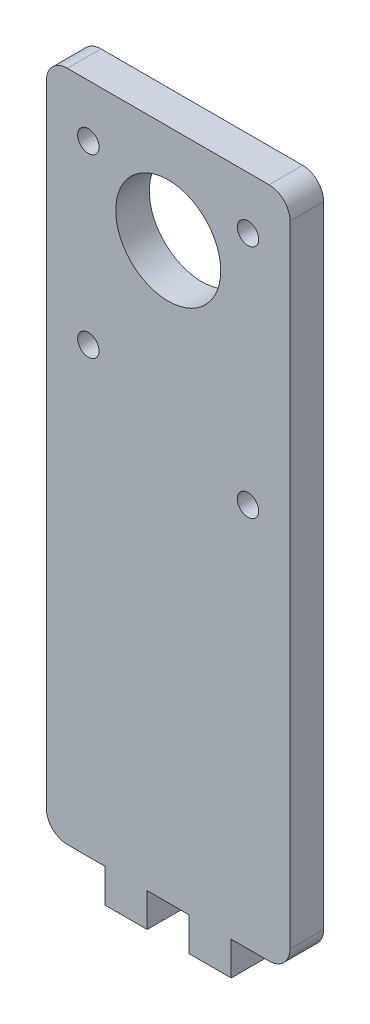
ISO-10303-21;
HEADER;
FILE_DESCRIPTION(('STEP AP214'),'2;1');
FILE_NAME('part.step','',(''),(''),'','','');
FILE_SCHEMA(('AUTOMOTIVE_DESIGN { 1 0 10303 214 1 1 1 1 }'));
ENDSEC;
DATA;
#1=APPLICATION_CONTEXT('core data for automotive mechanical design processes');
#2=APPLICATION_PROTOCOL_DEFINITION('international standard','automotive_design',2000,#1);
#3=PRODUCT_CONTEXT('',#1,'mechanical');
#4=PRODUCT('Part','Part','',(#3));
#5=PRODUCT_RELATED_PRODUCT_CATEGORY('part','',(#4));
#6=PRODUCT_DEFINITION_FORMATION('','',#4);
#7=PRODUCT_DEFINITION_CONTEXT('part definition',#1,'design');
#8=PRODUCT_DEFINITION('design','',#6,#7);
#9=PRODUCT_DEFINITION_SHAPE('','',#8);
#10=(LENGTH_UNIT() NAMED_UNIT(*) SI_UNIT(.MILLI.,.METRE.));
#11=(NAMED_UNIT(*) PLANE_ANGLE_UNIT() SI_UNIT($,.RADIAN.));
#12=(NAMED_UNIT(*) SI_UNIT($,.STERADIAN.) SOLID_ANGLE_UNIT());
#13=UNCERTAINTY_MEASURE_WITH_UNIT(LENGTH_MEASURE(1.E-05),#10,'distance_accuracy_value','');
#14=(GEOMETRIC_REPRESENTATION_CONTEXT(3) GLOBAL_UNCERTAINTY_ASSIGNED_CONTEXT((#13)) GLOBAL_UNIT_ASSIGNED_CONTEXT((#10,
#11,#12)) REPRESENTATION_CONTEXT('',''));
#15=CARTESIAN_POINT('',(0.,0.,0.));
#16=DIRECTION('',(0.,0.,1.));
#17=DIRECTION('',(1.,0.,0.));
#18=AXIS2_PLACEMENT_3D('',#15,#16,#17);
#19=CARTESIAN_POINT('',(-29.,-80.,8.));
#20=DIRECTION('',(0.,1.,0.));
#21=DIRECTION('',(0.,0.,1.));
#22=AXIS2_PLACEMENT_3D('',#19,#20,#21);
#23=PLANE('',#22);
#24=DIRECTION('',(0.,0.,-1.));
#25=VECTOR('',#24,1.);
#26=CARTESIAN_POINT('',(5.,-80.,0.));
#27=LINE('',#26,#25);
#28=CARTESIAN_POINT('',(4.99999999999998,-80.,8.));
#29=VERTEX_POINT('',#28);
#30=CARTESIAN_POINT('',(4.99999999999998,-80.,0.));
#31=VERTEX_POINT('',#30);
#32=EDGE_CURVE('E175',#29,#31,#27,.T.);
#33=ORIENTED_EDGE('',*,*,#32,.F.);
#34=DIRECTION('',(1.,0.,0.));
#35=VECTOR('',#34,1.);
#36=CARTESIAN_POINT('',(-29.,-80.,8.));
#37=LINE('',#36,#35);
#38=CARTESIAN_POINT('',(-5.00000000000002,-80.,8.));
#39=VERTEX_POINT('',#38);
#40=EDGE_CURVE('E244',#39,#29,#37,.T.);
#41=ORIENTED_EDGE('',*,*,#40,.F.);
#42=DIRECTION('',(0.,0.,1.));
#43=VECTOR('',#42,1.);
#44=CARTESIAN_POINT('',(-5.,-80.,0.));
#45=LINE('',#44,#43);
#46=CARTESIAN_POINT('',(-5.00000000000002,-80.,0.));
#47=VERTEX_POINT('',#46);
#48=EDGE_CURVE('E176',#47,#39,#45,.T.);
#49=ORIENTED_EDGE('',*,*,#48,.F.);
#50=DIRECTION('',(1.,0.,0.));
#51=VECTOR('',#50,1.);
#52=CARTESIAN_POINT('',(-29.,-80.,0.));
#53=LINE('',#52,#51);
#54=EDGE_CURVE('E212',#47,#31,#53,.T.);
#55=ORIENTED_EDGE('',*,*,#54,.T.);
#56=EDGE_LOOP('',(#33,#41,#49,#55));
#57=FACE_BOUND('',#56,.T.);
#58=ADVANCED_FACE('F35',(#57),#23,.F.);
#59=CARTESIAN_POINT('',(15.,-80.,0.));
#60=VERTEX_POINT('',#59);
#61=CARTESIAN_POINT('',(24.,-80.,0.));
#62=VERTEX_POINT('',#61);
#63=EDGE_CURVE('E208',#60,#62,#53,.T.);
#64=ORIENTED_EDGE('',*,*,#63,.T.);
#65=DIRECTION('',(0.,0.,-1.));
#66=VECTOR('',#65,1.);
#67=CARTESIAN_POINT('',(24.,-80.,8.));
#68=LINE('',#67,#66);
#69=CARTESIAN_POINT('',(24.,-80.,8.));
#70=VERTEX_POINT('',#69);
#71=EDGE_CURVE('E238',#62,#70,#68,.F.);
#72=ORIENTED_EDGE('',*,*,#71,.T.);
#73=CARTESIAN_POINT('',(15.,-80.,8.));
#74=VERTEX_POINT('',#73);
#75=EDGE_CURVE('E214',#74,#70,#37,.T.);
#76=ORIENTED_EDGE('',*,*,#75,.F.);
#77=DIRECTION('',(0.,0.,1.));
#78=VECTOR('',#77,1.);
#79=CARTESIAN_POINT('',(15.,-80.,0.));
#80=LINE('',#79,#78);
#81=EDGE_CURVE('E172',#60,#74,#80,.T.);
#82=ORIENTED_EDGE('',*,*,#81,.F.);
#83=EDGE_LOOP('',(#64,#72,#76,#82));
#84=FACE_BOUND('',#83,.T.);
#85=ADVANCED_FACE('F348',(#84),#23,.F.);
#86=CARTESIAN_POINT('',(-24.,-80.,8.));
#87=VERTEX_POINT('',#86);
#88=CARTESIAN_POINT('',(-15.,-80.,8.));
#89=VERTEX_POINT('',#88);
#90=EDGE_CURVE('E241',#87,#89,#37,.T.);
#91=ORIENTED_EDGE('',*,*,#90,.F.);
#92=DIRECTION('',(0.,0.,-1.));
#93=VECTOR('',#92,1.);
#94=CARTESIAN_POINT('',(-24.,-80.,8.));
#95=LINE('',#94,#93);
#96=CARTESIAN_POINT('',(-24.,-80.,0.));
#97=VERTEX_POINT('',#96);
#98=EDGE_CURVE('E321',#87,#97,#95,.T.);
#99=ORIENTED_EDGE('',*,*,#98,.T.);
#100=CARTESIAN_POINT('',(-15.,-80.,0.));
#101=VERTEX_POINT('',#100);
#102=EDGE_CURVE('E225',#97,#101,#53,.T.);
#103=ORIENTED_EDGE('',*,*,#102,.T.);
#104=DIRECTION('',(0.,0.,-1.));
#105=VECTOR('',#104,1.);
#106=CARTESIAN_POINT('',(-15.,-80.,0.));
#107=LINE('',#106,#105);
#108=EDGE_CURVE('E179',#89,#101,#107,.T.);
#109=ORIENTED_EDGE('',*,*,#108,.F.);
#110=EDGE_LOOP('',(#91,#99,#103,#109));
#111=FACE_BOUND('',#110,.T.);
#112=ADVANCED_FACE('F373',(#111),#23,.F.);
#113=CARTESIAN_POINT('',(29.,-80.,8.));
#114=DIRECTION('',(-1.,0.,0.));
#115=DIRECTION('',(0.,0.,1.));
#116=AXIS2_PLACEMENT_3D('',#113,#114,#115);
#117=PLANE('',#116);
#118=DIRECTION('',(0.,1.,0.));
#119=VECTOR('',#118,1.);
#120=CARTESIAN_POINT('',(29.,-80.,8.));
#121=LINE('',#120,#119);
#122=CARTESIAN_POINT('',(29.,-75.,8.));
#123=VERTEX_POINT('',#122);
#124=CARTESIAN_POINT('',(29.,75.,8.));
#125=VERTEX_POINT('',#124);
#126=EDGE_CURVE('E228',#123,#125,#121,.T.);
#127=ORIENTED_EDGE('',*,*,#126,.F.);
#128=DIRECTION('',(0.,0.,-1.));
#129=VECTOR('',#128,1.);
#130=CARTESIAN_POINT('',(29.,-75.,8.));
#131=LINE('',#130,#129);
#132=CARTESIAN_POINT('',(29.,-75.,0.));
#133=VERTEX_POINT('',#132);
#134=EDGE_CURVE('E229',#123,#133,#131,.T.);
#135=ORIENTED_EDGE('',*,*,#134,.T.);
#136=DIRECTION('',(0.,1.,0.));
#137=VECTOR('',#136,1.);
#138=CARTESIAN_POINT('',(29.,-80.,0.));
#139=LINE('',#138,#137);
#140=CARTESIAN_POINT('',(29.,75.,0.));
#141=VERTEX_POINT('',#140);
#142=EDGE_CURVE('E251',#133,#141,#139,.T.);
#143=ORIENTED_EDGE('',*,*,#142,.T.);
#144=DIRECTION('',(0.,0.,-1.));
#145=VECTOR('',#144,1.);
#146=CARTESIAN_POINT('',(29.,75.,8.));
#147=LINE('',#146,#145);
#148=EDGE_CURVE('E243',#141,#125,#147,.F.);
#149=ORIENTED_EDGE('',*,*,#148,.T.);
#150=EDGE_LOOP('',(#127,#135,#143,#149));
#151=FACE_BOUND('',#150,.T.);
#152=ADVANCED_FACE('F347',(#151),#117,.F.);
#153=CARTESIAN_POINT('',(-29.,80.,8.));
#154=DIRECTION('',(0.,-1.,0.));
#155=DIRECTION('',(0.,0.,-1.));
#156=AXIS2_PLACEMENT_3D('',#153,#154,#155);
#157=PLANE('',#156);
#158=DIRECTION('',(-1.,0.,0.));
#159=VECTOR('',#158,1.);
#160=CARTESIAN_POINT('',(-29.,80.,8.));
#161=LINE('',#160,#159);
#162=CARTESIAN_POINT('',(24.,80.,8.));
#163=VERTEX_POINT('',#162);
#164=CARTESIAN_POINT('',(-24.,80.,8.));
#165=VERTEX_POINT('',#164);
#166=EDGE_CURVE('E302',#163,#165,#161,.T.);
#167=ORIENTED_EDGE('',*,*,#166,.F.);
#168=DIRECTION('',(0.,0.,-1.));
#169=VECTOR('',#168,1.);
#170=CARTESIAN_POINT('',(24.,80.,8.));
#171=LINE('',#170,#169);
#172=CARTESIAN_POINT('',(24.,80.,0.));
#173=VERTEX_POINT('',#172);
#174=EDGE_CURVE('E11',#163,#173,#171,.T.);
#175=ORIENTED_EDGE('',*,*,#174,.T.);
#176=DIRECTION('',(-1.,0.,0.));
#177=VECTOR('',#176,1.);
#178=CARTESIAN_POINT('',(-29.,80.,0.));
#179=LINE('',#178,#177);
#180=CARTESIAN_POINT('',(-24.,80.,0.));
#181=VERTEX_POINT('',#180);
#182=EDGE_CURVE('E337',#173,#181,#179,.T.);
#183=ORIENTED_EDGE('',*,*,#182,.T.);
#184=DIRECTION('',(0.,0.,-1.));
#185=VECTOR('',#184,1.);
#186=CARTESIAN_POINT('',(-24.,80.,8.));
#187=LINE('',#186,#185);
#188=EDGE_CURVE('E43',#181,#165,#187,.F.);
#189=ORIENTED_EDGE('',*,*,#188,.T.);
#190=EDGE_LOOP('',(#167,#175,#183,#189));
#191=FACE_BOUND('',#190,.T.);
#192=ADVANCED_FACE('F334',(#191),#157,.F.);
#193=CARTESIAN_POINT('',(-29.,-80.,8.));
#194=DIRECTION('',(1.,0.,0.));
#195=DIRECTION('',(0.,0.,-1.));
#196=AXIS2_PLACEMENT_3D('',#193,#194,#195);
#197=PLANE('',#196);
#198=DIRECTION('',(0.,-1.,0.));
#199=VECTOR('',#198,1.);
#200=CARTESIAN_POINT('',(-29.,-80.,0.));
#201=LINE('',#200,#199);
#202=CARTESIAN_POINT('',(-29.,75.,0.));
#203=VERTEX_POINT('',#202);
#204=CARTESIAN_POINT('',(-29.,-75.,0.));
#205=VERTEX_POINT('',#204);
#206=EDGE_CURVE('E213',#203,#205,#201,.T.);
#207=ORIENTED_EDGE('',*,*,#206,.T.);
#208=DIRECTION('',(0.,0.,-1.));
#209=VECTOR('',#208,1.);
#210=CARTESIAN_POINT('',(-29.,-75.,8.));
#211=LINE('',#210,#209);
#212=CARTESIAN_POINT('',(-29.,-75.,8.));
#213=VERTEX_POINT('',#212);
#214=EDGE_CURVE('E58',#205,#213,#211,.F.);
#215=ORIENTED_EDGE('',*,*,#214,.T.);
#216=DIRECTION('',(0.,-1.,0.));
#217=VECTOR('',#216,1.);
#218=CARTESIAN_POINT('',(-29.,-80.,8.));
#219=LINE('',#218,#217);
#220=CARTESIAN_POINT('',(-29.,75.,8.));
#221=VERTEX_POINT('',#220);
#222=EDGE_CURVE('E249',#221,#213,#219,.T.);
#223=ORIENTED_EDGE('',*,*,#222,.F.);
#224=DIRECTION('',(0.,0.,-1.));
#225=VECTOR('',#224,1.);
#226=CARTESIAN_POINT('',(-29.,75.,8.));
#227=LINE('',#226,#225);
#228=EDGE_CURVE('E324',#221,#203,#227,.T.);
#229=ORIENTED_EDGE('',*,*,#228,.T.);
#230=EDGE_LOOP('',(#207,#215,#223,#229));
#231=FACE_BOUND('',#230,.T.);
#232=ADVANCED_FACE('F377',(#231),#197,.F.);
#233=CARTESIAN_POINT('',(0.,0.,8.));
#234=DIRECTION('',(0.,0.,-1.));
#235=DIRECTION('',(-1.,0.,0.));
#236=AXIS2_PLACEMENT_3D('',#233,#234,#235);
#237=PLANE('',#236);
#238=CARTESIAN_POINT('',(0.,56.5,8.));
#239=DIRECTION('',(0.,0.,1.));
#240=DIRECTION('',(1.,0.,0.));
#241=AXIS2_PLACEMENT_3D('',#238,#239,#240);
#242=CIRCLE('',#241,12.5);
#243=CARTESIAN_POINT('',(12.5,56.5,8.));
#244=VERTEX_POINT('',#243);
#245=EDGE_CURVE('E268',#244,#244,#242,.T.);
#246=ORIENTED_EDGE('',*,*,#245,.F.);
#247=EDGE_LOOP('',(#246));
#248=FACE_BOUND('',#247,.T.);
#249=CARTESIAN_POINT('',(19.0000000000027,11.5000000000061,8.));
#250=DIRECTION('',(0.,0.,1.));
#251=DIRECTION('',(1.,0.,0.));
#252=AXIS2_PLACEMENT_3D('',#249,#250,#251);
#253=CIRCLE('',#252,2.55);
#254=CARTESIAN_POINT('',(21.5500000000027,11.5000000000061,8.));
#255=VERTEX_POINT('',#254);
#256=EDGE_CURVE('E276',#255,#255,#253,.T.);
#257=ORIENTED_EDGE('',*,*,#256,.F.);
#258=EDGE_LOOP('',(#257));
#259=FACE_BOUND('',#258,.T.);
#260=CARTESIAN_POINT('',(-19.0000000000027,25.4999999999969,8.));
#261=DIRECTION('',(0.,0.,1.));
#262=DIRECTION('',(1.,0.,0.));
#263=AXIS2_PLACEMENT_3D('',#260,#261,#262);
#264=CIRCLE('',#263,2.55);
#265=CARTESIAN_POINT('',(-16.4500000000027,25.4999999999969,8.));
#266=VERTEX_POINT('',#265);
#267=EDGE_CURVE('E281',#266,#266,#264,.T.);
#268=ORIENTED_EDGE('',*,*,#267,.F.);
#269=EDGE_LOOP('',(#268));
#270=FACE_BOUND('',#269,.T.);
#271=CARTESIAN_POINT('',(19.0000000000027,67.4999999999977,8.));
#272=DIRECTION('',(0.,0.,1.));
#273=DIRECTION('',(1.,0.,0.));
#274=AXIS2_PLACEMENT_3D('',#271,#272,#273);
#275=CIRCLE('',#274,2.55);
#276=CARTESIAN_POINT('',(21.5500000000027,67.4999999999977,8.));
#277=VERTEX_POINT('',#276);
#278=EDGE_CURVE('E287',#277,#277,#275,.T.);
#279=ORIENTED_EDGE('',*,*,#278,.F.);
#280=EDGE_LOOP('',(#279));
#281=FACE_BOUND('',#280,.T.);
#282=CARTESIAN_POINT('',(-19.,67.5,8.));
#283=DIRECTION('',(0.,0.,1.));
#284=DIRECTION('',(1.,0.,0.));
#285=AXIS2_PLACEMENT_3D('',#282,#283,#284);
#286=CIRCLE('',#285,2.55);
#287=CARTESIAN_POINT('',(-16.45,67.5,8.));
#288=VERTEX_POINT('',#287);
#289=EDGE_CURVE('E293',#288,#288,#286,.T.);
#290=ORIENTED_EDGE('',*,*,#289,.F.);
#291=EDGE_LOOP('',(#290));
#292=FACE_BOUND('',#291,.T.);
#293=ORIENTED_EDGE('',*,*,#75,.T.);
#294=CARTESIAN_POINT('',(24.,-75.,8.));
#295=DIRECTION('',(0.,0.,-1.));
#296=DIRECTION('',(-1.,0.,0.));
#297=AXIS2_PLACEMENT_3D('',#294,#295,#296);
#298=CIRCLE('',#297,5.);
#299=EDGE_CURVE('E310',#70,#123,#298,.F.);
#300=ORIENTED_EDGE('',*,*,#299,.T.);
#301=ORIENTED_EDGE('',*,*,#126,.T.);
#302=CARTESIAN_POINT('',(24.,75.,8.));
#303=DIRECTION('',(0.,0.,-1.));
#304=DIRECTION('',(-1.,0.,0.));
#305=AXIS2_PLACEMENT_3D('',#302,#303,#304);
#306=CIRCLE('',#305,5.);
#307=EDGE_CURVE('E326',#125,#163,#306,.F.);
#308=ORIENTED_EDGE('',*,*,#307,.T.);
#309=ORIENTED_EDGE('',*,*,#166,.T.);
#310=CARTESIAN_POINT('',(-24.,75.,8.));
#311=DIRECTION('',(0.,0.,-1.));
#312=DIRECTION('',(-1.,0.,0.));
#313=AXIS2_PLACEMENT_3D('',#310,#311,#312);
#314=CIRCLE('',#313,5.);
#315=EDGE_CURVE('E240',#165,#221,#314,.F.);
#316=ORIENTED_EDGE('',*,*,#315,.T.);
#317=ORIENTED_EDGE('',*,*,#222,.T.);
#318=CARTESIAN_POINT('',(-24.,-75.,8.));
#319=DIRECTION('',(0.,0.,-1.));
#320=DIRECTION('',(-1.,0.,0.));
#321=AXIS2_PLACEMENT_3D('',#318,#319,#320);
#322=CIRCLE('',#321,5.);
#323=EDGE_CURVE('E50',#213,#87,#322,.F.);
#324=ORIENTED_EDGE('',*,*,#323,.T.);
#325=ORIENTED_EDGE('',*,*,#90,.T.);
#326=DIRECTION('',(0.,1.,0.));
#327=VECTOR('',#326,1.);
#328=CARTESIAN_POINT('',(-15.,-88.,8.));
#329=LINE('',#328,#327);
#330=CARTESIAN_POINT('',(-15.,-88.,8.));
#331=VERTEX_POINT('',#330);
#332=EDGE_CURVE('E260',#331,#89,#329,.T.);
#333=ORIENTED_EDGE('',*,*,#332,.F.);
#334=DIRECTION('',(-1.,0.,0.));
#335=VECTOR('',#334,1.);
#336=CARTESIAN_POINT('',(-5.,-88.,8.));
#337=LINE('',#336,#335);
#338=CARTESIAN_POINT('',(-5.,-88.,8.));
#339=VERTEX_POINT('',#338);
#340=EDGE_CURVE('E188',#339,#331,#337,.T.);
#341=ORIENTED_EDGE('',*,*,#340,.F.);
#342=DIRECTION('',(0.,1.,0.));
#343=VECTOR('',#342,1.);
#344=CARTESIAN_POINT('',(-5.,-88.,8.));
#345=LINE('',#344,#343);
#346=EDGE_CURVE('E265',#339,#39,#345,.T.);
#347=ORIENTED_EDGE('',*,*,#346,.T.);
#348=ORIENTED_EDGE('',*,*,#40,.T.);
#349=DIRECTION('',(0.,1.,0.));
#350=VECTOR('',#349,1.);
#351=CARTESIAN_POINT('',(5.,-88.,8.));
#352=LINE('',#351,#350);
#353=CARTESIAN_POINT('',(5.,-88.,8.));
#354=VERTEX_POINT('',#353);
#355=EDGE_CURVE('E353',#354,#29,#352,.T.);
#356=ORIENTED_EDGE('',*,*,#355,.F.);
#357=DIRECTION('',(-1.,0.,0.));
#358=VECTOR('',#357,1.);
#359=CARTESIAN_POINT('',(5.,-88.,8.));
#360=LINE('',#359,#358);
#361=CARTESIAN_POINT('',(15.,-88.,8.));
#362=VERTEX_POINT('',#361);
#363=EDGE_CURVE('E168',#362,#354,#360,.T.);
#364=ORIENTED_EDGE('',*,*,#363,.F.);
#365=DIRECTION('',(0.,1.,0.));
#366=VECTOR('',#365,1.);
#367=CARTESIAN_POINT('',(15.,-88.,8.));
#368=LINE('',#367,#366);
#369=EDGE_CURVE('E181',#362,#74,#368,.T.);
#370=ORIENTED_EDGE('',*,*,#369,.T.);
#371=EDGE_LOOP('',(#293,#300,#301,#308,#309,#316,#317,#324,#325,#333,#341,#347,#348,#356,#364,#370));
#372=FACE_BOUND('',#371,.T.);
#373=ADVANCED_FACE('F309',(#248,#259,#270,#281,#292,#372),#237,.F.);
#374=CARTESIAN_POINT('',(0.,0.,0.));
#375=DIRECTION('',(0.,0.,-1.));
#376=DIRECTION('',(-1.,0.,0.));
#377=AXIS2_PLACEMENT_3D('',#374,#375,#376);
#378=PLANE('',#377);
#379=CARTESIAN_POINT('',(0.,56.5,0.));
#380=DIRECTION('',(0.,0.,1.));
#381=DIRECTION('',(1.,0.,0.));
#382=AXIS2_PLACEMENT_3D('',#379,#380,#381);
#383=CIRCLE('',#382,12.5);
#384=CARTESIAN_POINT('',(12.5,56.5,0.));
#385=VERTEX_POINT('',#384);
#386=EDGE_CURVE('E271',#385,#385,#383,.T.);
#387=ORIENTED_EDGE('',*,*,#386,.T.);
#388=EDGE_LOOP('',(#387));
#389=FACE_BOUND('',#388,.T.);
#390=CARTESIAN_POINT('',(19.0000000000027,11.5000000000061,0.));
#391=DIRECTION('',(0.,0.,1.));
#392=DIRECTION('',(1.,0.,0.));
#393=AXIS2_PLACEMENT_3D('',#390,#391,#392);
#394=CIRCLE('',#393,2.55);
#395=CARTESIAN_POINT('',(21.5500000000027,11.5000000000061,0.));
#396=VERTEX_POINT('',#395);
#397=EDGE_CURVE('E278',#396,#396,#394,.T.);
#398=ORIENTED_EDGE('',*,*,#397,.T.);
#399=EDGE_LOOP('',(#398));
#400=FACE_BOUND('',#399,.T.);
#401=CARTESIAN_POINT('',(-19.0000000000027,25.4999999999969,0.));
#402=DIRECTION('',(0.,0.,1.));
#403=DIRECTION('',(1.,0.,0.));
#404=AXIS2_PLACEMENT_3D('',#401,#402,#403);
#405=CIRCLE('',#404,2.55);
#406=CARTESIAN_POINT('',(-16.4500000000027,25.4999999999969,0.));
#407=VERTEX_POINT('',#406);
#408=EDGE_CURVE('E284',#407,#407,#405,.T.);
#409=ORIENTED_EDGE('',*,*,#408,.T.);
#410=EDGE_LOOP('',(#409));
#411=FACE_BOUND('',#410,.T.);
#412=CARTESIAN_POINT('',(19.0000000000027,67.4999999999977,0.));
#413=DIRECTION('',(0.,0.,1.));
#414=DIRECTION('',(1.,0.,0.));
#415=AXIS2_PLACEMENT_3D('',#412,#413,#414);
#416=CIRCLE('',#415,2.55);
#417=CARTESIAN_POINT('',(21.5500000000027,67.4999999999977,0.));
#418=VERTEX_POINT('',#417);
#419=EDGE_CURVE('E290',#418,#418,#416,.T.);
#420=ORIENTED_EDGE('',*,*,#419,.T.);
#421=EDGE_LOOP('',(#420));
#422=FACE_BOUND('',#421,.T.);
#423=CARTESIAN_POINT('',(-19.,67.5,0.));
#424=DIRECTION('',(0.,0.,1.));
#425=DIRECTION('',(1.,0.,0.));
#426=AXIS2_PLACEMENT_3D('',#423,#424,#425);
#427=CIRCLE('',#426,2.55);
#428=CARTESIAN_POINT('',(-16.45,67.5,0.));
#429=VERTEX_POINT('',#428);
#430=EDGE_CURVE('E296',#429,#429,#427,.T.);
#431=ORIENTED_EDGE('',*,*,#430,.T.);
#432=EDGE_LOOP('',(#431));
#433=FACE_BOUND('',#432,.T.);
#434=ORIENTED_EDGE('',*,*,#142,.F.);
#435=CARTESIAN_POINT('',(24.,-75.,0.));
#436=DIRECTION('',(0.,0.,-1.));
#437=DIRECTION('',(-1.,0.,0.));
#438=AXIS2_PLACEMENT_3D('',#435,#436,#437);
#439=CIRCLE('',#438,5.);
#440=EDGE_CURVE('E236',#133,#62,#439,.T.);
#441=ORIENTED_EDGE('',*,*,#440,.T.);
#442=ORIENTED_EDGE('',*,*,#63,.F.);
#443=DIRECTION('',(0.,1.,0.));
#444=VECTOR('',#443,1.);
#445=CARTESIAN_POINT('',(15.,-88.,0.));
#446=LINE('',#445,#444);
#447=CARTESIAN_POINT('',(15.,-88.,0.));
#448=VERTEX_POINT('',#447);
#449=EDGE_CURVE('E159',#448,#60,#446,.T.);
#450=ORIENTED_EDGE('',*,*,#449,.F.);
#451=DIRECTION('',(1.,0.,0.));
#452=VECTOR('',#451,1.);
#453=CARTESIAN_POINT('',(5.,-88.,0.));
#454=LINE('',#453,#452);
#455=CARTESIAN_POINT('',(5.,-88.,0.));
#456=VERTEX_POINT('',#455);
#457=EDGE_CURVE('E150',#456,#448,#454,.T.);
#458=ORIENTED_EDGE('',*,*,#457,.F.);
#459=DIRECTION('',(0.,1.,0.));
#460=VECTOR('',#459,1.);
#461=CARTESIAN_POINT('',(5.,-88.,0.));
#462=LINE('',#461,#460);
#463=EDGE_CURVE('E156',#456,#31,#462,.T.);
#464=ORIENTED_EDGE('',*,*,#463,.T.);
#465=ORIENTED_EDGE('',*,*,#54,.F.);
#466=DIRECTION('',(0.,1.,0.));
#467=VECTOR('',#466,1.);
#468=CARTESIAN_POINT('',(-5.,-88.,0.));
#469=LINE('',#468,#467);
#470=CARTESIAN_POINT('',(-5.,-88.,0.));
#471=VERTEX_POINT('',#470);
#472=EDGE_CURVE('E194',#471,#47,#469,.T.);
#473=ORIENTED_EDGE('',*,*,#472,.F.);
#474=DIRECTION('',(1.,0.,0.));
#475=VECTOR('',#474,1.);
#476=CARTESIAN_POINT('',(-5.,-88.,0.));
#477=LINE('',#476,#475);
#478=CARTESIAN_POINT('',(-15.,-88.,0.));
#479=VERTEX_POINT('',#478);
#480=EDGE_CURVE('E192',#479,#471,#477,.T.);
#481=ORIENTED_EDGE('',*,*,#480,.F.);
#482=DIRECTION('',(0.,1.,0.));
#483=VECTOR('',#482,1.);
#484=CARTESIAN_POINT('',(-15.,-88.,0.));
#485=LINE('',#484,#483);
#486=EDGE_CURVE('E205',#479,#101,#485,.T.);
#487=ORIENTED_EDGE('',*,*,#486,.T.);
#488=ORIENTED_EDGE('',*,*,#102,.F.);
#489=CARTESIAN_POINT('',(-24.,-75.,0.));
#490=DIRECTION('',(0.,0.,-1.));
#491=DIRECTION('',(-1.,0.,0.));
#492=AXIS2_PLACEMENT_3D('',#489,#490,#491);
#493=CIRCLE('',#492,5.);
#494=EDGE_CURVE('E234',#97,#205,#493,.T.);
#495=ORIENTED_EDGE('',*,*,#494,.T.);
#496=ORIENTED_EDGE('',*,*,#206,.F.);
#497=CARTESIAN_POINT('',(-24.,75.,0.));
#498=DIRECTION('',(0.,0.,-1.));
#499=DIRECTION('',(-1.,0.,0.));
#500=AXIS2_PLACEMENT_3D('',#497,#498,#499);
#501=CIRCLE('',#500,5.);
#502=EDGE_CURVE('E230',#203,#181,#501,.T.);
#503=ORIENTED_EDGE('',*,*,#502,.T.);
#504=ORIENTED_EDGE('',*,*,#182,.F.);
#505=CARTESIAN_POINT('',(24.,75.,0.));
#506=DIRECTION('',(0.,0.,-1.));
#507=DIRECTION('',(-1.,0.,0.));
#508=AXIS2_PLACEMENT_3D('',#505,#506,#507);
#509=CIRCLE('',#508,5.);
#510=EDGE_CURVE('E232',#173,#141,#509,.T.);
#511=ORIENTED_EDGE('',*,*,#510,.T.);
#512=EDGE_LOOP('',(#434,#441,#442,#450,#458,#464,#465,#473,#481,#487,#488,#495,#496,#503,#504,#511));
#513=FACE_BOUND('',#512,.T.);
#514=ADVANCED_FACE('F153',(#389,#400,#411,#422,#433,#513),#378,.T.);
#515=CARTESIAN_POINT('',(-19.,67.5,0.));
#516=DIRECTION('',(0.,0.,1.));
#517=DIRECTION('',(1.,0.,0.));
#518=AXIS2_PLACEMENT_3D('',#515,#516,#517);
#519=CYLINDRICAL_SURFACE('',#518,2.55);
#520=ORIENTED_EDGE('',*,*,#430,.F.);
#521=EDGE_LOOP('',(#520));
#522=FACE_BOUND('',#521,.T.);
#523=ORIENTED_EDGE('',*,*,#289,.T.);
#524=EDGE_LOOP('',(#523));
#525=FACE_BOUND('',#524,.T.);
#526=ADVANCED_FACE('F437',(#522,#525),#519,.F.);
#527=CARTESIAN_POINT('',(19.0000000000027,67.4999999999977,0.));
#528=DIRECTION('',(0.,0.,1.));
#529=DIRECTION('',(1.,0.,0.));
#530=AXIS2_PLACEMENT_3D('',#527,#528,#529);
#531=CYLINDRICAL_SURFACE('',#530,2.55);
#532=ORIENTED_EDGE('',*,*,#419,.F.);
#533=EDGE_LOOP('',(#532));
#534=FACE_BOUND('',#533,.T.);
#535=ORIENTED_EDGE('',*,*,#278,.T.);
#536=EDGE_LOOP('',(#535));
#537=FACE_BOUND('',#536,.T.);
#538=ADVANCED_FACE('F551',(#534,#537),#531,.F.);
#539=CARTESIAN_POINT('',(-19.0000000000027,25.4999999999969,0.));
#540=DIRECTION('',(0.,0.,1.));
#541=DIRECTION('',(1.,0.,0.));
#542=AXIS2_PLACEMENT_3D('',#539,#540,#541);
#543=CYLINDRICAL_SURFACE('',#542,2.55);
#544=ORIENTED_EDGE('',*,*,#408,.F.);
#545=EDGE_LOOP('',(#544));
#546=FACE_BOUND('',#545,.T.);
#547=ORIENTED_EDGE('',*,*,#267,.T.);
#548=EDGE_LOOP('',(#547));
#549=FACE_BOUND('',#548,.T.);
#550=ADVANCED_FACE('F541',(#546,#549),#543,.F.);
#551=CARTESIAN_POINT('',(19.0000000000027,11.5000000000061,0.));
#552=DIRECTION('',(0.,0.,1.));
#553=DIRECTION('',(1.,0.,0.));
#554=AXIS2_PLACEMENT_3D('',#551,#552,#553);
#555=CYLINDRICAL_SURFACE('',#554,2.55);
#556=ORIENTED_EDGE('',*,*,#397,.F.);
#557=EDGE_LOOP('',(#556));
#558=FACE_BOUND('',#557,.T.);
#559=ORIENTED_EDGE('',*,*,#256,.T.);
#560=EDGE_LOOP('',(#559));
#561=FACE_BOUND('',#560,.T.);
#562=ADVANCED_FACE('F531',(#558,#561),#555,.F.);
#563=CARTESIAN_POINT('',(0.,56.5,0.));
#564=DIRECTION('',(0.,0.,1.));
#565=DIRECTION('',(1.,0.,0.));
#566=AXIS2_PLACEMENT_3D('',#563,#564,#565);
#567=CYLINDRICAL_SURFACE('',#566,12.5);
#568=ORIENTED_EDGE('',*,*,#386,.F.);
#569=EDGE_LOOP('',(#568));
#570=FACE_BOUND('',#569,.T.);
#571=ORIENTED_EDGE('',*,*,#245,.T.);
#572=EDGE_LOOP('',(#571));
#573=FACE_BOUND('',#572,.T.);
#574=ADVANCED_FACE('F519',(#570,#573),#567,.F.);
#575=CARTESIAN_POINT('',(-5.,-88.,0.));
#576=DIRECTION('',(-1.,0.,0.));
#577=DIRECTION('',(0.,0.,1.));
#578=AXIS2_PLACEMENT_3D('',#575,#576,#577);
#579=PLANE('',#578);
#580=ORIENTED_EDGE('',*,*,#48,.T.);
#581=ORIENTED_EDGE('',*,*,#346,.F.);
#582=DIRECTION('',(0.,0.,1.));
#583=VECTOR('',#582,1.);
#584=CARTESIAN_POINT('',(-5.,-88.,0.));
#585=LINE('',#584,#583);
#586=EDGE_CURVE('E185',#471,#339,#585,.T.);
#587=ORIENTED_EDGE('',*,*,#586,.F.);
#588=ORIENTED_EDGE('',*,*,#472,.T.);
#589=EDGE_LOOP('',(#580,#581,#587,#588));
#590=FACE_BOUND('',#589,.T.);
#591=ADVANCED_FACE('F362',(#590),#579,.F.);
#592=CARTESIAN_POINT('',(-15.,-88.,0.));
#593=DIRECTION('',(1.,0.,0.));
#594=DIRECTION('',(0.,0.,-1.));
#595=AXIS2_PLACEMENT_3D('',#592,#593,#594);
#596=PLANE('',#595);
#597=ORIENTED_EDGE('',*,*,#108,.T.);
#598=ORIENTED_EDGE('',*,*,#486,.F.);
#599=DIRECTION('',(0.,0.,-1.));
#600=VECTOR('',#599,1.);
#601=CARTESIAN_POINT('',(-15.,-88.,0.));
#602=LINE('',#601,#600);
#603=EDGE_CURVE('E190',#331,#479,#602,.T.);
#604=ORIENTED_EDGE('',*,*,#603,.F.);
#605=ORIENTED_EDGE('',*,*,#332,.T.);
#606=EDGE_LOOP('',(#597,#598,#604,#605));
#607=FACE_BOUND('',#606,.T.);
#608=ADVANCED_FACE('F370',(#607),#596,.F.);
#609=CARTESIAN_POINT('',(0.,-88.,0.));
#610=DIRECTION('',(0.,-1.,0.));
#611=DIRECTION('',(0.,0.,-1.));
#612=AXIS2_PLACEMENT_3D('',#609,#610,#611);
#613=PLANE('',#612);
#614=ORIENTED_EDGE('',*,*,#586,.T.);
#615=ORIENTED_EDGE('',*,*,#340,.T.);
#616=ORIENTED_EDGE('',*,*,#603,.T.);
#617=ORIENTED_EDGE('',*,*,#480,.T.);
#618=EDGE_LOOP('',(#614,#615,#616,#617));
#619=FACE_BOUND('',#618,.T.);
#620=ADVANCED_FACE('F364',(#619),#613,.T.);
#621=CARTESIAN_POINT('',(5.,-88.,0.));
#622=DIRECTION('',(1.,0.,0.));
#623=DIRECTION('',(0.,0.,-1.));
#624=AXIS2_PLACEMENT_3D('',#621,#622,#623);
#625=PLANE('',#624);
#626=ORIENTED_EDGE('',*,*,#32,.T.);
#627=ORIENTED_EDGE('',*,*,#463,.F.);
#628=DIRECTION('',(0.,0.,-1.));
#629=VECTOR('',#628,1.);
#630=CARTESIAN_POINT('',(5.,-88.,0.));
#631=LINE('',#630,#629);
#632=EDGE_CURVE('E163',#354,#456,#631,.T.);
#633=ORIENTED_EDGE('',*,*,#632,.F.);
#634=ORIENTED_EDGE('',*,*,#355,.T.);
#635=EDGE_LOOP('',(#626,#627,#633,#634));
#636=FACE_BOUND('',#635,.T.);
#637=ADVANCED_FACE('F174',(#636),#625,.F.);
#638=CARTESIAN_POINT('',(15.,-88.,0.));
#639=DIRECTION('',(-1.,0.,0.));
#640=DIRECTION('',(0.,0.,1.));
#641=AXIS2_PLACEMENT_3D('',#638,#639,#640);
#642=PLANE('',#641);
#643=ORIENTED_EDGE('',*,*,#81,.T.);
#644=ORIENTED_EDGE('',*,*,#369,.F.);
#645=DIRECTION('',(0.,0.,1.));
#646=VECTOR('',#645,1.);
#647=CARTESIAN_POINT('',(15.,-88.,0.));
#648=LINE('',#647,#646);
#649=EDGE_CURVE('E162',#448,#362,#648,.T.);
#650=ORIENTED_EDGE('',*,*,#649,.F.);
#651=ORIENTED_EDGE('',*,*,#449,.T.);
#652=EDGE_LOOP('',(#643,#644,#650,#651));
#653=FACE_BOUND('',#652,.T.);
#654=ADVANCED_FACE('F351',(#653),#642,.F.);
#655=CARTESIAN_POINT('',(0.,-88.,0.));
#656=DIRECTION('',(0.,1.,0.));
#657=DIRECTION('',(0.,0.,1.));
#658=AXIS2_PLACEMENT_3D('',#655,#656,#657);
#659=PLANE('',#658);
#660=ORIENTED_EDGE('',*,*,#632,.T.);
#661=ORIENTED_EDGE('',*,*,#457,.T.);
#662=ORIENTED_EDGE('',*,*,#649,.T.);
#663=ORIENTED_EDGE('',*,*,#363,.T.);
#664=EDGE_LOOP('',(#660,#661,#662,#663));
#665=FACE_BOUND('',#664,.T.);
#666=ADVANCED_FACE('F166',(#665),#659,.F.);
#667=CARTESIAN_POINT('',(24.,-75.,8.));
#668=DIRECTION('',(0.,0.,-1.));
#669=DIRECTION('',(-1.,0.,0.));
#670=AXIS2_PLACEMENT_3D('',#667,#668,#669);
#671=CYLINDRICAL_SURFACE('',#670,5.);
#672=ORIENTED_EDGE('',*,*,#299,.F.);
#673=ORIENTED_EDGE('',*,*,#71,.F.);
#674=ORIENTED_EDGE('',*,*,#440,.F.);
#675=ORIENTED_EDGE('',*,*,#134,.F.);
#676=EDGE_LOOP('',(#672,#673,#674,#675));
#677=FACE_BOUND('',#676,.T.);
#678=ADVANCED_FACE('F319',(#677),#671,.T.);
#679=CARTESIAN_POINT('',(-24.,-75.,8.));
#680=DIRECTION('',(0.,0.,-1.));
#681=DIRECTION('',(-1.,0.,0.));
#682=AXIS2_PLACEMENT_3D('',#679,#680,#681);
#683=CYLINDRICAL_SURFACE('',#682,5.);
#684=ORIENTED_EDGE('',*,*,#323,.F.);
#685=ORIENTED_EDGE('',*,*,#214,.F.);
#686=ORIENTED_EDGE('',*,*,#494,.F.);
#687=ORIENTED_EDGE('',*,*,#98,.F.);
#688=EDGE_LOOP('',(#684,#685,#686,#687));
#689=FACE_BOUND('',#688,.T.);
#690=ADVANCED_FACE('F376',(#689),#683,.T.);
#691=CARTESIAN_POINT('',(24.,75.,8.));
#692=DIRECTION('',(0.,0.,-1.));
#693=DIRECTION('',(-1.,0.,0.));
#694=AXIS2_PLACEMENT_3D('',#691,#692,#693);
#695=CYLINDRICAL_SURFACE('',#694,5.);
#696=ORIENTED_EDGE('',*,*,#307,.F.);
#697=ORIENTED_EDGE('',*,*,#148,.F.);
#698=ORIENTED_EDGE('',*,*,#510,.F.);
#699=ORIENTED_EDGE('',*,*,#174,.F.);
#700=EDGE_LOOP('',(#696,#697,#698,#699));
#701=FACE_BOUND('',#700,.T.);
#702=ADVANCED_FACE('F343',(#701),#695,.T.);
#703=CARTESIAN_POINT('',(-24.,75.,8.));
#704=DIRECTION('',(0.,0.,-1.));
#705=DIRECTION('',(-1.,0.,0.));
#706=AXIS2_PLACEMENT_3D('',#703,#704,#705);
#707=CYLINDRICAL_SURFACE('',#706,5.);
#708=ORIENTED_EDGE('',*,*,#315,.F.);
#709=ORIENTED_EDGE('',*,*,#188,.F.);
#710=ORIENTED_EDGE('',*,*,#502,.F.);
#711=ORIENTED_EDGE('',*,*,#228,.F.);
#712=EDGE_LOOP('',(#708,#709,#710,#711));
#713=FACE_BOUND('',#712,.T.);
#714=ADVANCED_FACE('F37',(#713),#707,.T.);
#715=CLOSED_SHELL('',(#58,#85,#112,#152,#192,#232,#373,#514,#526,#538,#550,#562,#574,#591,#608,
#620,#637,#654,#666,#678,#690,#702,#714));
#716=MANIFOLD_SOLID_BREP('B2',#715);
#717=ADVANCED_BREP_SHAPE_REPRESENTATION('',(#18,#716),#14);
#718=SHAPE_DEFINITION_REPRESENTATION(#9,#717);
ENDSEC;
END-ISO-10303-21;
